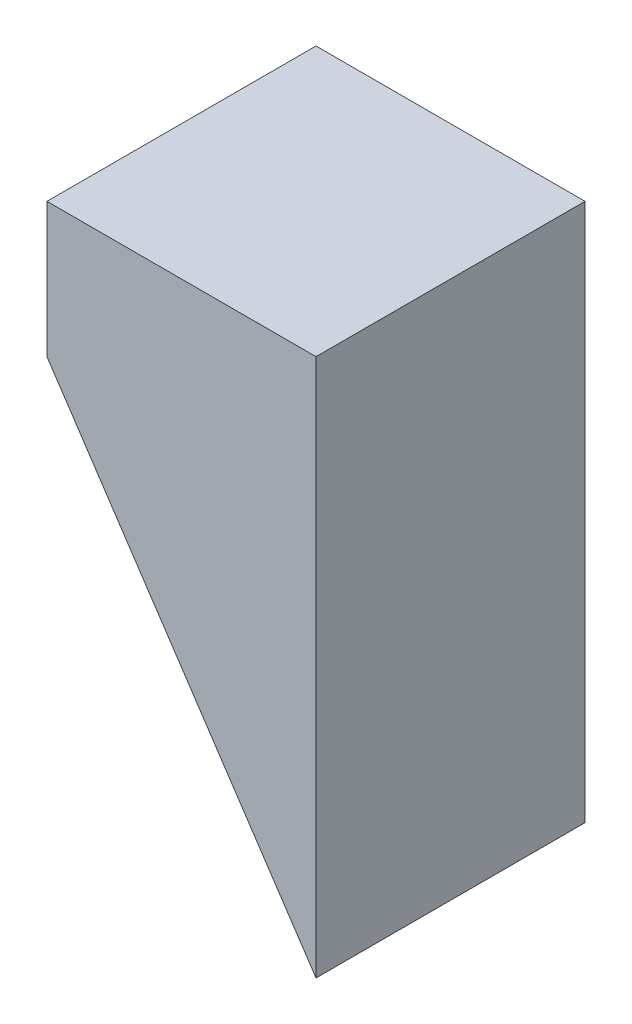
ISO-10303-21;
HEADER;
FILE_DESCRIPTION(('STEP AP214'),'2;1');
FILE_NAME('part.step','',(''),(''),'','','');
FILE_SCHEMA(('AUTOMOTIVE_DESIGN { 1 0 10303 214 1 1 1 1 }'));
ENDSEC;
DATA;
#1=APPLICATION_CONTEXT('core data for automotive mechanical design processes');
#2=APPLICATION_PROTOCOL_DEFINITION('international standard','automotive_design',2000,#1);
#3=PRODUCT_CONTEXT('',#1,'mechanical');
#4=PRODUCT('Part','Part','',(#3));
#5=PRODUCT_RELATED_PRODUCT_CATEGORY('part','',(#4));
#6=PRODUCT_DEFINITION_FORMATION('','',#4);
#7=PRODUCT_DEFINITION_CONTEXT('part definition',#1,'design');
#8=PRODUCT_DEFINITION('design','',#6,#7);
#9=PRODUCT_DEFINITION_SHAPE('','',#8);
#10=(LENGTH_UNIT() NAMED_UNIT(*) SI_UNIT(.MILLI.,.METRE.));
#11=(NAMED_UNIT(*) PLANE_ANGLE_UNIT() SI_UNIT($,.RADIAN.));
#12=(NAMED_UNIT(*) SI_UNIT($,.STERADIAN.) SOLID_ANGLE_UNIT());
#13=UNCERTAINTY_MEASURE_WITH_UNIT(LENGTH_MEASURE(1.E-05),#10,'distance_accuracy_value','');
#14=(GEOMETRIC_REPRESENTATION_CONTEXT(3) GLOBAL_UNCERTAINTY_ASSIGNED_CONTEXT((#13)) GLOBAL_UNIT_ASSIGNED_CONTEXT((#10,
#11,#12)) REPRESENTATION_CONTEXT('',''));
#15=CARTESIAN_POINT('',(0.,0.,0.));
#16=DIRECTION('',(0.,0.,1.));
#17=DIRECTION('',(1.,0.,0.));
#18=AXIS2_PLACEMENT_3D('',#15,#16,#17);
#19=CARTESIAN_POINT('',(-18.9403163014465,20.5685618729097,30.));
#20=DIRECTION('',(1.,0.,0.));
#21=DIRECTION('',(0.,1.,0.));
#22=AXIS2_PLACEMENT_3D('',#19,#20,#21);
#23=PLANE('',#22);
#24=DIRECTION('',(0.,-1.,0.));
#25=VECTOR('',#24,1.);
#26=CARTESIAN_POINT('',(-18.9403163014465,20.5685618729097,0.));
#27=LINE('',#26,#25);
#28=CARTESIAN_POINT('',(-18.9403163014465,20.5685618729097,0.));
#29=VERTEX_POINT('',#28);
#30=CARTESIAN_POINT('',(-18.9403163014465,5.5685618729097,0.));
#31=VERTEX_POINT('',#30);
#32=EDGE_CURVE('E132',#29,#31,#27,.T.);
#33=ORIENTED_EDGE('',*,*,#32,.T.);
#34=DIRECTION('',(0.,0.,-1.));
#35=VECTOR('',#34,1.);
#36=CARTESIAN_POINT('',(-18.9403163014465,5.5685618729097,30.));
#37=LINE('',#36,#35);
#38=CARTESIAN_POINT('',(-18.9403163014465,5.5685618729097,30.));
#39=VERTEX_POINT('',#38);
#40=EDGE_CURVE('E157',#39,#31,#37,.T.);
#41=ORIENTED_EDGE('',*,*,#40,.F.);
#42=DIRECTION('',(0.,-1.,0.));
#43=VECTOR('',#42,1.);
#44=CARTESIAN_POINT('',(-18.9403163014465,20.5685618729097,30.));
#45=LINE('',#44,#43);
#46=CARTESIAN_POINT('',(-18.9403163014465,20.5685618729097,30.));
#47=VERTEX_POINT('',#46);
#48=EDGE_CURVE('E137',#47,#39,#45,.T.);
#49=ORIENTED_EDGE('',*,*,#48,.F.);
#50=DIRECTION('',(0.,0.,-1.));
#51=VECTOR('',#50,1.);
#52=CARTESIAN_POINT('',(-18.9403163014465,20.5685618729097,30.));
#53=LINE('',#52,#51);
#54=EDGE_CURVE('E143',#47,#29,#53,.T.);
#55=ORIENTED_EDGE('',*,*,#54,.T.);
#56=EDGE_LOOP('',(#33,#41,#49,#55));
#57=FACE_BOUND('',#56,.T.);
#58=ADVANCED_FACE('F33',(#57),#23,.F.);
#59=CARTESIAN_POINT('',(-18.9403163014465,5.5685618729097,30.));
#60=DIRECTION('',(0.832050294337844,0.554700196225229,0.));
#61=DIRECTION('',(-0.554700196225229,0.832050294337844,0.));
#62=AXIS2_PLACEMENT_3D('',#59,#60,#61);
#63=PLANE('',#62);
#64=DIRECTION('',(0.,0.,-1.));
#65=VECTOR('',#64,1.);
#66=CARTESIAN_POINT('',(3.70348020718828,-28.3971328900424,30.));
#67=LINE('',#66,#65);
#68=CARTESIAN_POINT('',(3.70348020718828,-28.3971328900424,25.));
#69=VERTEX_POINT('',#68);
#70=CARTESIAN_POINT('',(3.70348020718828,-28.3971328900424,5.));
#71=VERTEX_POINT('',#70);
#72=EDGE_CURVE('E159',#69,#71,#67,.T.);
#73=ORIENTED_EDGE('',*,*,#72,.T.);
#74=DIRECTION('',(-0.554700196225229,0.832050294337844,0.));
#75=VECTOR('',#74,1.);
#76=CARTESIAN_POINT('',(-18.9403163014465,5.5685618729097,5.));
#77=LINE('',#76,#75);
#78=CARTESIAN_POINT('',(-16.4755081601279,1.87134966093183,5.));
#79=VERTEX_POINT('',#78);
#80=EDGE_CURVE('E11',#71,#79,#77,.T.);
#81=ORIENTED_EDGE('',*,*,#80,.T.);
#82=DIRECTION('',(0.,0.,1.));
#83=VECTOR('',#82,1.);
#84=CARTESIAN_POINT('',(-16.4755081601279,1.87134966093183,30.));
#85=LINE('',#84,#83);
#86=CARTESIAN_POINT('',(-16.4755081601279,1.87134966093183,25.));
#87=VERTEX_POINT('',#86);
#88=EDGE_CURVE('E40',#79,#87,#85,.T.);
#89=ORIENTED_EDGE('',*,*,#88,.T.);
#90=DIRECTION('',(0.554700196225229,-0.832050294337844,0.));
#91=VECTOR('',#90,1.);
#92=CARTESIAN_POINT('',(-18.9403163014465,5.5685618729097,25.));
#93=LINE('',#92,#91);
#94=EDGE_CURVE('E161',#87,#69,#93,.T.);
#95=ORIENTED_EDGE('',*,*,#94,.T.);
#96=EDGE_LOOP('',(#73,#81,#89,#95));
#97=FACE_BOUND('',#96,.T.);
#98=DIRECTION('',(0.554700196225229,-0.832050294337844,0.));
#99=VECTOR('',#98,1.);
#100=CARTESIAN_POINT('',(-18.9403163014465,5.5685618729097,0.));
#101=LINE('',#100,#99);
#102=CARTESIAN_POINT('',(11.0596836985535,-39.4314381270903,0.));
#103=VERTEX_POINT('',#102);
#104=EDGE_CURVE('E146',#31,#103,#101,.T.);
#105=ORIENTED_EDGE('',*,*,#104,.T.);
#106=DIRECTION('',(0.,0.,-1.));
#107=VECTOR('',#106,1.);
#108=CARTESIAN_POINT('',(11.0596836985535,-39.4314381270903,30.));
#109=LINE('',#108,#107);
#110=CARTESIAN_POINT('',(11.0596836985535,-39.4314381270903,30.));
#111=VERTEX_POINT('',#110);
#112=EDGE_CURVE('E154',#111,#103,#109,.T.);
#113=ORIENTED_EDGE('',*,*,#112,.F.);
#114=DIRECTION('',(0.554700196225229,-0.832050294337844,0.));
#115=VECTOR('',#114,1.);
#116=CARTESIAN_POINT('',(-18.9403163014465,5.5685618729097,30.));
#117=LINE('',#116,#115);
#118=EDGE_CURVE('E85',#39,#111,#117,.T.);
#119=ORIENTED_EDGE('',*,*,#118,.F.);
#120=ORIENTED_EDGE('',*,*,#40,.T.);
#121=EDGE_LOOP('',(#105,#113,#119,#120));
#122=FACE_BOUND('',#121,.T.);
#123=ADVANCED_FACE('F165',(#97,#122),#63,.F.);
#124=CARTESIAN_POINT('',(11.0596836985535,20.5685618729097,30.));
#125=DIRECTION('',(-1.,0.,0.));
#126=DIRECTION('',(0.,-1.,0.));
#127=AXIS2_PLACEMENT_3D('',#124,#125,#126);
#128=PLANE('',#127);
#129=DIRECTION('',(0.,1.,0.));
#130=VECTOR('',#129,1.);
#131=CARTESIAN_POINT('',(11.0596836985535,20.5685618729097,0.));
#132=LINE('',#131,#130);
#133=CARTESIAN_POINT('',(11.0596836985535,20.5685618729097,0.));
#134=VERTEX_POINT('',#133);
#135=EDGE_CURVE('E148',#103,#134,#132,.T.);
#136=ORIENTED_EDGE('',*,*,#135,.T.);
#137=DIRECTION('',(0.,0.,-1.));
#138=VECTOR('',#137,1.);
#139=CARTESIAN_POINT('',(11.0596836985535,20.5685618729097,30.));
#140=LINE('',#139,#138);
#141=CARTESIAN_POINT('',(11.0596836985535,20.5685618729097,30.));
#142=VERTEX_POINT('',#141);
#143=EDGE_CURVE('E152',#142,#134,#140,.T.);
#144=ORIENTED_EDGE('',*,*,#143,.F.);
#145=DIRECTION('',(0.,1.,0.));
#146=VECTOR('',#145,1.);
#147=CARTESIAN_POINT('',(11.0596836985535,20.5685618729097,30.));
#148=LINE('',#147,#146);
#149=EDGE_CURVE('E140',#111,#142,#148,.T.);
#150=ORIENTED_EDGE('',*,*,#149,.F.);
#151=ORIENTED_EDGE('',*,*,#112,.T.);
#152=EDGE_LOOP('',(#136,#144,#150,#151));
#153=FACE_BOUND('',#152,.T.);
#154=ADVANCED_FACE('F183',(#153),#128,.F.);
#155=CARTESIAN_POINT('',(-18.9403163014465,20.5685618729097,30.));
#156=DIRECTION('',(0.,-1.,0.));
#157=DIRECTION('',(0.,0.,-1.));
#158=AXIS2_PLACEMENT_3D('',#155,#156,#157);
#159=PLANE('',#158);
#160=DIRECTION('',(-1.,0.,0.));
#161=VECTOR('',#160,1.);
#162=CARTESIAN_POINT('',(-18.9403163014465,20.5685618729097,0.));
#163=LINE('',#162,#161);
#164=EDGE_CURVE('E77',#134,#29,#163,.T.);
#165=ORIENTED_EDGE('',*,*,#164,.T.);
#166=ORIENTED_EDGE('',*,*,#54,.F.);
#167=DIRECTION('',(-1.,0.,0.));
#168=VECTOR('',#167,1.);
#169=CARTESIAN_POINT('',(-18.9403163014465,20.5685618729097,30.));
#170=LINE('',#169,#168);
#171=EDGE_CURVE('E56',#142,#47,#170,.T.);
#172=ORIENTED_EDGE('',*,*,#171,.F.);
#173=ORIENTED_EDGE('',*,*,#143,.T.);
#174=EDGE_LOOP('',(#165,#166,#172,#173));
#175=FACE_BOUND('',#174,.T.);
#176=ADVANCED_FACE('F195',(#175),#159,.F.);
#177=CARTESIAN_POINT('',(0.,0.,30.));
#178=DIRECTION('',(0.,0.,1.));
#179=DIRECTION('',(1.,0.,0.));
#180=AXIS2_PLACEMENT_3D('',#177,#178,#179);
#181=PLANE('',#180);
#182=ORIENTED_EDGE('',*,*,#48,.T.);
#183=ORIENTED_EDGE('',*,*,#118,.T.);
#184=ORIENTED_EDGE('',*,*,#149,.T.);
#185=ORIENTED_EDGE('',*,*,#171,.T.);
#186=EDGE_LOOP('',(#182,#183,#184,#185));
#187=FACE_BOUND('',#186,.T.);
#188=ADVANCED_FACE('F193',(#187),#181,.T.);
#189=CARTESIAN_POINT('',(0.,0.,0.));
#190=DIRECTION('',(0.,0.,1.));
#191=DIRECTION('',(1.,0.,0.));
#192=AXIS2_PLACEMENT_3D('',#189,#190,#191);
#193=PLANE('',#192);
#194=ORIENTED_EDGE('',*,*,#32,.F.);
#195=ORIENTED_EDGE('',*,*,#164,.F.);
#196=ORIENTED_EDGE('',*,*,#135,.F.);
#197=ORIENTED_EDGE('',*,*,#104,.F.);
#198=EDGE_LOOP('',(#194,#195,#196,#197));
#199=FACE_BOUND('',#198,.T.);
#200=ADVANCED_FACE('F188',(#199),#193,.F.);
#201=CARTESIAN_POINT('',(8.05968369855355,1.87134966093184,5.));
#202=DIRECTION('',(0.,0.,-1.));
#203=DIRECTION('',(0.,1.,0.));
#204=AXIS2_PLACEMENT_3D('',#201,#202,#203);
#205=PLANE('',#204);
#206=DIRECTION('',(-1.,0.,0.));
#207=VECTOR('',#206,1.);
#208=CARTESIAN_POINT('',(8.05968369855356,-28.3971328900424,5.));
#209=LINE('',#208,#207);
#210=CARTESIAN_POINT('',(8.05968369855356,-28.3971328900424,5.));
#211=VERTEX_POINT('',#210);
#212=EDGE_CURVE('E47',#211,#71,#209,.T.);
#213=ORIENTED_EDGE('',*,*,#212,.F.);
#214=DIRECTION('',(0.,-1.,0.));
#215=VECTOR('',#214,1.);
#216=CARTESIAN_POINT('',(8.05968369855355,1.87134966093184,5.));
#217=LINE('',#216,#215);
#218=CARTESIAN_POINT('',(8.05968369855355,1.87134966093184,5.));
#219=VERTEX_POINT('',#218);
#220=EDGE_CURVE('E109',#219,#211,#217,.T.);
#221=ORIENTED_EDGE('',*,*,#220,.F.);
#222=DIRECTION('',(-1.,0.,0.));
#223=VECTOR('',#222,1.);
#224=CARTESIAN_POINT('',(8.05968369855355,1.87134966093184,5.));
#225=LINE('',#224,#223);
#226=EDGE_CURVE('E130',#219,#79,#225,.T.);
#227=ORIENTED_EDGE('',*,*,#226,.T.);
#228=ORIENTED_EDGE('',*,*,#80,.F.);
#229=EDGE_LOOP('',(#213,#221,#227,#228));
#230=FACE_BOUND('',#229,.T.);
#231=ADVANCED_FACE('F106',(#230),#205,.F.);
#232=CARTESIAN_POINT('',(8.05968369855355,1.87134966093184,5.));
#233=DIRECTION('',(0.,1.,0.));
#234=DIRECTION('',(-1.,0.,0.));
#235=AXIS2_PLACEMENT_3D('',#232,#233,#234);
#236=PLANE('',#235);
#237=ORIENTED_EDGE('',*,*,#226,.F.);
#238=DIRECTION('',(0.,0.,-1.));
#239=VECTOR('',#238,1.);
#240=CARTESIAN_POINT('',(8.05968369855355,1.87134966093184,5.));
#241=LINE('',#240,#239);
#242=CARTESIAN_POINT('',(8.05968369855355,1.87134966093184,25.));
#243=VERTEX_POINT('',#242);
#244=EDGE_CURVE('E113',#243,#219,#241,.T.);
#245=ORIENTED_EDGE('',*,*,#244,.F.);
#246=DIRECTION('',(-1.,0.,0.));
#247=VECTOR('',#246,1.);
#248=CARTESIAN_POINT('',(8.05968369855355,1.87134966093184,25.));
#249=LINE('',#248,#247);
#250=EDGE_CURVE('E133',#243,#87,#249,.T.);
#251=ORIENTED_EDGE('',*,*,#250,.T.);
#252=ORIENTED_EDGE('',*,*,#88,.F.);
#253=EDGE_LOOP('',(#237,#245,#251,#252));
#254=FACE_BOUND('',#253,.T.);
#255=ADVANCED_FACE('F167',(#254),#236,.F.);
#256=CARTESIAN_POINT('',(8.05968369855355,1.87134966093184,25.));
#257=DIRECTION('',(0.,0.,1.));
#258=DIRECTION('',(0.,-1.,0.));
#259=AXIS2_PLACEMENT_3D('',#256,#257,#258);
#260=PLANE('',#259);
#261=ORIENTED_EDGE('',*,*,#250,.F.);
#262=DIRECTION('',(0.,1.,0.));
#263=VECTOR('',#262,1.);
#264=CARTESIAN_POINT('',(8.05968369855355,1.87134966093184,25.));
#265=LINE('',#264,#263);
#266=CARTESIAN_POINT('',(8.05968369855356,-28.3971328900424,25.));
#267=VERTEX_POINT('',#266);
#268=EDGE_CURVE('E122',#267,#243,#265,.T.);
#269=ORIENTED_EDGE('',*,*,#268,.F.);
#270=DIRECTION('',(-1.,0.,0.));
#271=VECTOR('',#270,1.);
#272=CARTESIAN_POINT('',(8.05968369855356,-28.3971328900424,25.));
#273=LINE('',#272,#271);
#274=EDGE_CURVE('E112',#267,#69,#273,.T.);
#275=ORIENTED_EDGE('',*,*,#274,.T.);
#276=ORIENTED_EDGE('',*,*,#94,.F.);
#277=EDGE_LOOP('',(#261,#269,#275,#276));
#278=FACE_BOUND('',#277,.T.);
#279=ADVANCED_FACE('F169',(#278),#260,.F.);
#280=CARTESIAN_POINT('',(8.05968369855356,-28.3971328900424,5.));
#281=DIRECTION('',(0.,-1.,0.));
#282=DIRECTION('',(1.,0.,0.));
#283=AXIS2_PLACEMENT_3D('',#280,#281,#282);
#284=PLANE('',#283);
#285=ORIENTED_EDGE('',*,*,#274,.F.);
#286=DIRECTION('',(0.,0.,1.));
#287=VECTOR('',#286,1.);
#288=CARTESIAN_POINT('',(8.05968369855356,-28.3971328900424,5.));
#289=LINE('',#288,#287);
#290=EDGE_CURVE('E116',#211,#267,#289,.T.);
#291=ORIENTED_EDGE('',*,*,#290,.F.);
#292=ORIENTED_EDGE('',*,*,#212,.T.);
#293=ORIENTED_EDGE('',*,*,#72,.F.);
#294=EDGE_LOOP('',(#285,#291,#292,#293));
#295=FACE_BOUND('',#294,.T.);
#296=ADVANCED_FACE('F117',(#295),#284,.F.);
#297=CARTESIAN_POINT('',(8.05968369855355,0.,0.));
#298=DIRECTION('',(-1.,0.,0.));
#299=DIRECTION('',(0.,-1.,0.));
#300=AXIS2_PLACEMENT_3D('',#297,#298,#299);
#301=PLANE('',#300);
#302=ORIENTED_EDGE('',*,*,#220,.T.);
#303=ORIENTED_EDGE('',*,*,#290,.T.);
#304=ORIENTED_EDGE('',*,*,#268,.T.);
#305=ORIENTED_EDGE('',*,*,#244,.T.);
#306=EDGE_LOOP('',(#302,#303,#304,#305));
#307=FACE_BOUND('',#306,.T.);
#308=ADVANCED_FACE('F124',(#307),#301,.T.);
#309=CLOSED_SHELL('',(#58,#123,#154,#176,#188,#200,#231,#255,#279,#296,#308));
#310=MANIFOLD_SOLID_BREP('B2',#309);
#311=ADVANCED_BREP_SHAPE_REPRESENTATION('',(#18,#310),#14);
#312=SHAPE_DEFINITION_REPRESENTATION(#9,#311);
ENDSEC;
END-ISO-10303-21;
